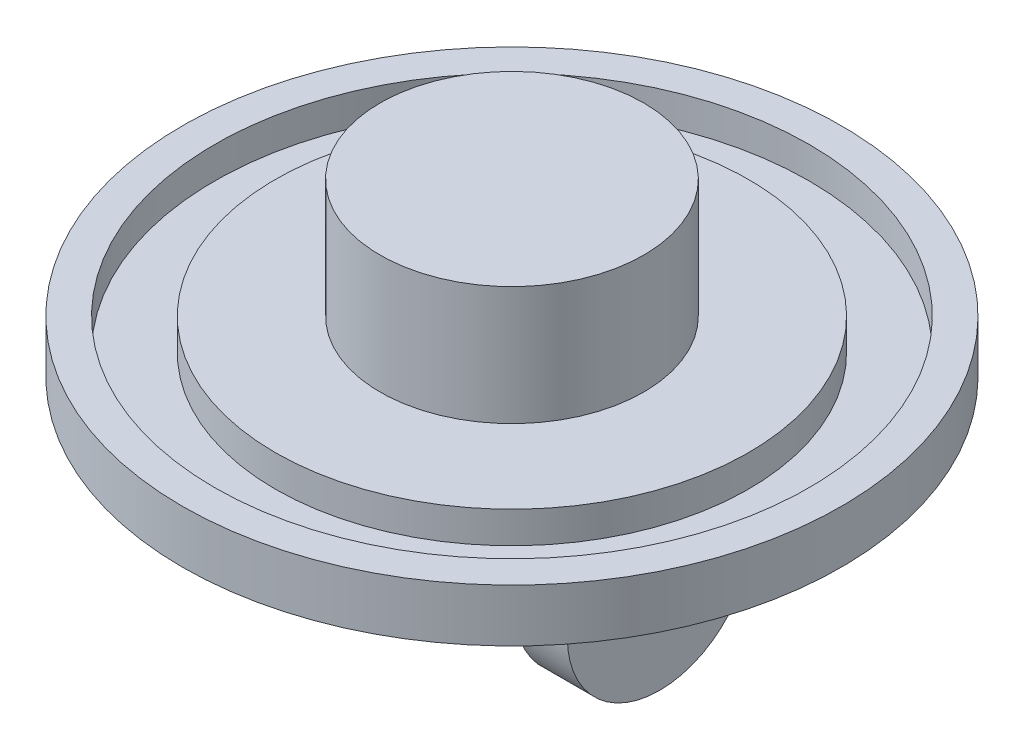
ISO-10303-21;
HEADER;
FILE_DESCRIPTION(('STEP AP214'),'2;1');
FILE_NAME('part.step','',(''),(''),'','','');
FILE_SCHEMA(('AUTOMOTIVE_DESIGN { 1 0 10303 214 1 1 1 1 }'));
ENDSEC;
DATA;
#1=APPLICATION_CONTEXT('core data for automotive mechanical design processes');
#2=APPLICATION_PROTOCOL_DEFINITION('international standard','automotive_design',2000,#1);
#3=PRODUCT_CONTEXT('',#1,'mechanical');
#4=PRODUCT('Part','Part','',(#3));
#5=PRODUCT_RELATED_PRODUCT_CATEGORY('part','',(#4));
#6=PRODUCT_DEFINITION_FORMATION('','',#4);
#7=PRODUCT_DEFINITION_CONTEXT('part definition',#1,'design');
#8=PRODUCT_DEFINITION('design','',#6,#7);
#9=PRODUCT_DEFINITION_SHAPE('','',#8);
#10=(LENGTH_UNIT() NAMED_UNIT(*) SI_UNIT(.MILLI.,.METRE.));
#11=(NAMED_UNIT(*) PLANE_ANGLE_UNIT() SI_UNIT($,.RADIAN.));
#12=(NAMED_UNIT(*) SI_UNIT($,.STERADIAN.) SOLID_ANGLE_UNIT());
#13=UNCERTAINTY_MEASURE_WITH_UNIT(LENGTH_MEASURE(1.E-05),#10,'distance_accuracy_value','');
#14=(GEOMETRIC_REPRESENTATION_CONTEXT(3) GLOBAL_UNCERTAINTY_ASSIGNED_CONTEXT((#13)) GLOBAL_UNIT_ASSIGNED_CONTEXT((#10,
#11,#12)) REPRESENTATION_CONTEXT('',''));
#15=CARTESIAN_POINT('',(0.,0.,0.));
#16=DIRECTION('',(0.,0.,1.));
#17=DIRECTION('',(1.,0.,0.));
#18=AXIS2_PLACEMENT_3D('',#15,#16,#17);
#19=CARTESIAN_POINT('',(-56.,-75.,0.));
#20=DIRECTION('',(1.,0.,0.));
#21=DIRECTION('',(0.,0.,-1.));
#22=AXIS2_PLACEMENT_3D('',#19,#20,#21);
#23=PLANE('',#22);
#24=CARTESIAN_POINT('',(-56.,-40.,0.));
#25=DIRECTION('',(-1.,0.,0.));
#26=DIRECTION('',(0.,0.,1.));
#27=AXIS2_PLACEMENT_3D('',#24,#25,#26);
#28=CIRCLE('',#27,35.);
#29=CARTESIAN_POINT('',(-56.,-40.,-35.));
#30=VERTEX_POINT('',#29);
#31=CARTESIAN_POINT('',(-56.,-40.,35.));
#32=VERTEX_POINT('',#31);
#33=EDGE_CURVE('E117',#30,#32,#28,.T.);
#34=ORIENTED_EDGE('',*,*,#33,.T.);
#35=DIRECTION('',(0.,1.,0.));
#36=VECTOR('',#35,1.);
#37=CARTESIAN_POINT('',(-56.,-75.,35.));
#38=LINE('',#37,#36);
#39=CARTESIAN_POINT('',(-56.,0.,35.));
#40=VERTEX_POINT('',#39);
#41=EDGE_CURVE('E74',#32,#40,#38,.T.);
#42=ORIENTED_EDGE('',*,*,#41,.T.);
#43=DIRECTION('',(0.,0.,-1.));
#44=VECTOR('',#43,1.);
#45=CARTESIAN_POINT('',(-56.,0.,0.));
#46=LINE('',#45,#44);
#47=CARTESIAN_POINT('',(-56.,0.,-35.));
#48=VERTEX_POINT('',#47);
#49=EDGE_CURVE('E163',#40,#48,#46,.T.);
#50=ORIENTED_EDGE('',*,*,#49,.T.);
#51=DIRECTION('',(0.,1.,0.));
#52=VECTOR('',#51,1.);
#53=CARTESIAN_POINT('',(-56.,-75.,-35.));
#54=LINE('',#53,#52);
#55=EDGE_CURVE('E119',#30,#48,#54,.T.);
#56=ORIENTED_EDGE('',*,*,#55,.F.);
#57=EDGE_LOOP('',(#34,#42,#50,#56));
#58=FACE_BOUND('',#57,.T.);
#59=ADVANCED_FACE('F49',(#58),#23,.F.);
#60=CARTESIAN_POINT('',(-36.,-75.,0.));
#61=DIRECTION('',(-1.,0.,0.));
#62=DIRECTION('',(0.,0.,1.));
#63=AXIS2_PLACEMENT_3D('',#60,#61,#62);
#64=PLANE('',#63);
#65=DIRECTION('',(0.,1.,0.));
#66=VECTOR('',#65,1.);
#67=CARTESIAN_POINT('',(-36.,-75.,35.));
#68=LINE('',#67,#66);
#69=CARTESIAN_POINT('',(-36.,-40.,35.));
#70=VERTEX_POINT('',#69);
#71=CARTESIAN_POINT('',(-36.,0.,35.));
#72=VERTEX_POINT('',#71);
#73=EDGE_CURVE('E168',#70,#72,#68,.T.);
#74=ORIENTED_EDGE('',*,*,#73,.F.);
#75=CARTESIAN_POINT('',(-36.,-40.,0.));
#76=DIRECTION('',(-1.,0.,0.));
#77=DIRECTION('',(0.,0.,1.));
#78=AXIS2_PLACEMENT_3D('',#75,#76,#77);
#79=CIRCLE('',#78,35.);
#80=CARTESIAN_POINT('',(-36.,-40.,-35.));
#81=VERTEX_POINT('',#80);
#82=EDGE_CURVE('E129',#81,#70,#79,.T.);
#83=ORIENTED_EDGE('',*,*,#82,.F.);
#84=DIRECTION('',(0.,1.,0.));
#85=VECTOR('',#84,1.);
#86=CARTESIAN_POINT('',(-36.,-75.,-35.));
#87=LINE('',#86,#85);
#88=CARTESIAN_POINT('',(-36.,0.,-35.));
#89=VERTEX_POINT('',#88);
#90=EDGE_CURVE('E143',#81,#89,#87,.T.);
#91=ORIENTED_EDGE('',*,*,#90,.T.);
#92=DIRECTION('',(0.,0.,1.));
#93=VECTOR('',#92,1.);
#94=CARTESIAN_POINT('',(-36.,0.,0.));
#95=LINE('',#94,#93);
#96=EDGE_CURVE('E161',#89,#72,#95,.T.);
#97=ORIENTED_EDGE('',*,*,#96,.T.);
#98=EDGE_LOOP('',(#74,#83,#91,#97));
#99=FACE_BOUND('',#98,.T.);
#100=ADVANCED_FACE('F167',(#99),#64,.F.);
#101=CARTESIAN_POINT('',(36.,-75.,0.));
#102=DIRECTION('',(-1.,0.,0.));
#103=DIRECTION('',(0.,0.,1.));
#104=AXIS2_PLACEMENT_3D('',#101,#102,#103);
#105=PLANE('',#104);
#106=CARTESIAN_POINT('',(36.,-40.,0.));
#107=DIRECTION('',(-1.,0.,0.));
#108=DIRECTION('',(0.,0.,1.));
#109=AXIS2_PLACEMENT_3D('',#106,#107,#108);
#110=CIRCLE('',#109,35.);
#111=CARTESIAN_POINT('',(36.,-40.,-35.));
#112=VERTEX_POINT('',#111);
#113=CARTESIAN_POINT('',(36.,-40.,35.));
#114=VERTEX_POINT('',#113);
#115=EDGE_CURVE('E122',#112,#114,#110,.T.);
#116=ORIENTED_EDGE('',*,*,#115,.T.);
#117=DIRECTION('',(0.,1.,0.));
#118=VECTOR('',#117,1.);
#119=CARTESIAN_POINT('',(36.,-75.,35.));
#120=LINE('',#119,#118);
#121=CARTESIAN_POINT('',(36.,0.,35.));
#122=VERTEX_POINT('',#121);
#123=EDGE_CURVE('E164',#114,#122,#120,.T.);
#124=ORIENTED_EDGE('',*,*,#123,.T.);
#125=DIRECTION('',(0.,0.,1.));
#126=VECTOR('',#125,1.);
#127=CARTESIAN_POINT('',(36.,0.,0.));
#128=LINE('',#127,#126);
#129=CARTESIAN_POINT('',(36.,0.,-35.));
#130=VERTEX_POINT('',#129);
#131=EDGE_CURVE('E187',#130,#122,#128,.T.);
#132=ORIENTED_EDGE('',*,*,#131,.F.);
#133=DIRECTION('',(0.,1.,0.));
#134=VECTOR('',#133,1.);
#135=CARTESIAN_POINT('',(36.,-75.,-35.));
#136=LINE('',#135,#134);
#137=EDGE_CURVE('E177',#112,#130,#136,.T.);
#138=ORIENTED_EDGE('',*,*,#137,.F.);
#139=EDGE_LOOP('',(#116,#124,#132,#138));
#140=FACE_BOUND('',#139,.T.);
#141=ADVANCED_FACE('F251',(#140),#105,.T.);
#142=CARTESIAN_POINT('',(56.,-75.,0.));
#143=DIRECTION('',(1.,0.,0.));
#144=DIRECTION('',(0.,0.,-1.));
#145=AXIS2_PLACEMENT_3D('',#142,#143,#144);
#146=PLANE('',#145);
#147=DIRECTION('',(0.,1.,0.));
#148=VECTOR('',#147,1.);
#149=CARTESIAN_POINT('',(56.0000000000001,-75.,35.));
#150=LINE('',#149,#148);
#151=CARTESIAN_POINT('',(56.0000000000001,-40.,35.));
#152=VERTEX_POINT('',#151);
#153=CARTESIAN_POINT('',(56.0000000000001,0.,35.));
#154=VERTEX_POINT('',#153);
#155=EDGE_CURVE('E180',#152,#154,#150,.T.);
#156=ORIENTED_EDGE('',*,*,#155,.F.);
#157=CARTESIAN_POINT('',(56.,-40.,0.));
#158=DIRECTION('',(1.,0.,0.));
#159=DIRECTION('',(0.,0.,-1.));
#160=AXIS2_PLACEMENT_3D('',#157,#158,#159);
#161=CIRCLE('',#160,35.);
#162=CARTESIAN_POINT('',(56.,-40.,-35.));
#163=VERTEX_POINT('',#162);
#164=EDGE_CURVE('E198',#163,#152,#161,.F.);
#165=ORIENTED_EDGE('',*,*,#164,.F.);
#166=DIRECTION('',(0.,1.,0.));
#167=VECTOR('',#166,1.);
#168=CARTESIAN_POINT('',(56.,-75.,-35.));
#169=LINE('',#168,#167);
#170=CARTESIAN_POINT('',(56.,0.,-35.));
#171=VERTEX_POINT('',#170);
#172=EDGE_CURVE('E66',#163,#171,#169,.T.);
#173=ORIENTED_EDGE('',*,*,#172,.T.);
#174=DIRECTION('',(0.,0.,-1.));
#175=VECTOR('',#174,1.);
#176=CARTESIAN_POINT('',(56.,0.,0.));
#177=LINE('',#176,#175);
#178=EDGE_CURVE('E182',#154,#171,#177,.T.);
#179=ORIENTED_EDGE('',*,*,#178,.F.);
#180=EDGE_LOOP('',(#156,#165,#173,#179));
#181=FACE_BOUND('',#180,.T.);
#182=ADVANCED_FACE('F257',(#181),#146,.T.);
#183=CARTESIAN_POINT('',(0.,-75.,35.));
#184=DIRECTION('',(0.,0.,-1.));
#185=DIRECTION('',(-1.,0.,0.));
#186=AXIS2_PLACEMENT_3D('',#183,#184,#185);
#187=PLANE('',#186);
#188=DIRECTION('',(-1.,0.,0.));
#189=VECTOR('',#188,1.);
#190=CARTESIAN_POINT('',(105.497474683058,-40.,35.));
#191=LINE('',#190,#189);
#192=EDGE_CURVE('E126',#70,#32,#191,.T.);
#193=ORIENTED_EDGE('',*,*,#192,.F.);
#194=ORIENTED_EDGE('',*,*,#73,.T.);
#195=DIRECTION('',(-1.,0.,0.));
#196=VECTOR('',#195,1.);
#197=CARTESIAN_POINT('',(0.,0.,35.));
#198=LINE('',#197,#196);
#199=EDGE_CURVE('E138',#72,#40,#198,.T.);
#200=ORIENTED_EDGE('',*,*,#199,.T.);
#201=ORIENTED_EDGE('',*,*,#41,.F.);
#202=EDGE_LOOP('',(#193,#194,#200,#201));
#203=FACE_BOUND('',#202,.T.);
#204=ADVANCED_FACE('F136',(#203),#187,.F.);
#205=CARTESIAN_POINT('',(0.,-75.,-35.));
#206=DIRECTION('',(0.,0.,-1.));
#207=DIRECTION('',(-1.,0.,0.));
#208=AXIS2_PLACEMENT_3D('',#205,#206,#207);
#209=PLANE('',#208);
#210=ORIENTED_EDGE('',*,*,#90,.F.);
#211=DIRECTION('',(-1.,0.,0.));
#212=VECTOR('',#211,1.);
#213=CARTESIAN_POINT('',(105.497474683058,-40.,-35.));
#214=LINE('',#213,#212);
#215=EDGE_CURVE('E197',#81,#30,#214,.T.);
#216=ORIENTED_EDGE('',*,*,#215,.T.);
#217=ORIENTED_EDGE('',*,*,#55,.T.);
#218=DIRECTION('',(-1.,0.,0.));
#219=VECTOR('',#218,1.);
#220=CARTESIAN_POINT('',(0.,0.,-35.));
#221=LINE('',#220,#219);
#222=EDGE_CURVE('E170',#89,#48,#221,.T.);
#223=ORIENTED_EDGE('',*,*,#222,.F.);
#224=EDGE_LOOP('',(#210,#216,#217,#223));
#225=FACE_BOUND('',#224,.T.);
#226=ADVANCED_FACE('F156',(#225),#209,.T.);
#227=CARTESIAN_POINT('',(0.,0.,0.));
#228=DIRECTION('',(0.,1.,0.));
#229=DIRECTION('',(0.,0.,1.));
#230=AXIS2_PLACEMENT_3D('',#227,#228,#229);
#231=PLANE('',#230);
#232=CARTESIAN_POINT('',(0.,0.,0.));
#233=DIRECTION('',(0.,-1.,0.));
#234=DIRECTION('',(0.,0.,-1.));
#235=AXIS2_PLACEMENT_3D('',#232,#233,#234);
#236=CIRCLE('',#235,15.);
#237=CARTESIAN_POINT('',(0.,0.,-15.));
#238=VERTEX_POINT('',#237);
#239=EDGE_CURVE('E213',#238,#238,#236,.T.);
#240=ORIENTED_EDGE('',*,*,#239,.F.);
#241=EDGE_LOOP('',(#240));
#242=FACE_BOUND('',#241,.T.);
#243=ORIENTED_EDGE('',*,*,#131,.T.);
#244=DIRECTION('',(1.,0.,0.));
#245=VECTOR('',#244,1.);
#246=CARTESIAN_POINT('',(0.,0.,35.));
#247=LINE('',#246,#245);
#248=EDGE_CURVE('E190',#122,#154,#247,.T.);
#249=ORIENTED_EDGE('',*,*,#248,.T.);
#250=ORIENTED_EDGE('',*,*,#178,.T.);
#251=DIRECTION('',(1.,0.,0.));
#252=VECTOR('',#251,1.);
#253=CARTESIAN_POINT('',(0.,0.,-35.));
#254=LINE('',#253,#252);
#255=EDGE_CURVE('E185',#130,#171,#254,.T.);
#256=ORIENTED_EDGE('',*,*,#255,.F.);
#257=EDGE_LOOP('',(#243,#249,#250,#256));
#258=FACE_BOUND('',#257,.T.);
#259=CARTESIAN_POINT('',(0.,0.,0.));
#260=DIRECTION('',(0.,1.,0.));
#261=DIRECTION('',(0.,0.,1.));
#262=AXIS2_PLACEMENT_3D('',#259,#260,#261);
#263=CIRCLE('',#262,125.);
#264=CARTESIAN_POINT('',(0.,0.,125.));
#265=VERTEX_POINT('',#264);
#266=EDGE_CURVE('E53',#265,#265,#263,.T.);
#267=ORIENTED_EDGE('',*,*,#266,.F.);
#268=EDGE_LOOP('',(#267));
#269=FACE_BOUND('',#268,.T.);
#270=ORIENTED_EDGE('',*,*,#199,.F.);
#271=ORIENTED_EDGE('',*,*,#96,.F.);
#272=ORIENTED_EDGE('',*,*,#222,.T.);
#273=ORIENTED_EDGE('',*,*,#49,.F.);
#274=EDGE_LOOP('',(#270,#271,#272,#273));
#275=FACE_BOUND('',#274,.T.);
#276=ADVANCED_FACE('F153',(#242,#258,#269,#275),#231,.F.);
#277=CARTESIAN_POINT('',(0.,20.,0.));
#278=DIRECTION('',(0.,-1.,0.));
#279=DIRECTION('',(0.,0.,-1.));
#280=AXIS2_PLACEMENT_3D('',#277,#278,#279);
#281=CYLINDRICAL_SURFACE('',#280,125.);
#282=CARTESIAN_POINT('',(0.,20.,0.));
#283=DIRECTION('',(0.,1.,0.));
#284=DIRECTION('',(0.,0.,1.));
#285=AXIS2_PLACEMENT_3D('',#282,#283,#284);
#286=CIRCLE('',#285,125.);
#287=CARTESIAN_POINT('',(0.,20.,125.));
#288=VERTEX_POINT('',#287);
#289=EDGE_CURVE('E58',#288,#288,#286,.T.);
#290=ORIENTED_EDGE('',*,*,#289,.F.);
#291=EDGE_LOOP('',(#290));
#292=FACE_BOUND('',#291,.T.);
#293=ORIENTED_EDGE('',*,*,#266,.T.);
#294=EDGE_LOOP('',(#293));
#295=FACE_BOUND('',#294,.T.);
#296=ADVANCED_FACE('F51',(#292,#295),#281,.T.);
#297=CARTESIAN_POINT('',(0.,20.,0.));
#298=DIRECTION('',(0.,1.,0.));
#299=DIRECTION('',(0.,0.,1.));
#300=AXIS2_PLACEMENT_3D('',#297,#298,#299);
#301=PLANE('',#300);
#302=CARTESIAN_POINT('',(0.,20.,0.));
#303=DIRECTION('',(0.,1.,0.));
#304=DIRECTION('',(0.,0.,1.));
#305=AXIS2_PLACEMENT_3D('',#302,#303,#304);
#306=CIRCLE('',#305,112.75);
#307=CARTESIAN_POINT('',(0.,20.,112.75));
#308=VERTEX_POINT('',#307);
#309=EDGE_CURVE('E201',#308,#308,#306,.T.);
#310=ORIENTED_EDGE('',*,*,#309,.F.);
#311=EDGE_LOOP('',(#310));
#312=FACE_BOUND('',#311,.T.);
#313=ORIENTED_EDGE('',*,*,#289,.T.);
#314=EDGE_LOOP('',(#313));
#315=FACE_BOUND('',#314,.T.);
#316=ADVANCED_FACE('F285',(#312,#315),#301,.T.);
#317=CARTESIAN_POINT('',(0.,-75.,35.));
#318=DIRECTION('',(0.,0.,1.));
#319=DIRECTION('',(1.,0.,0.));
#320=AXIS2_PLACEMENT_3D('',#317,#318,#319);
#321=PLANE('',#320);
#322=EDGE_CURVE('E132',#152,#114,#191,.T.);
#323=ORIENTED_EDGE('',*,*,#322,.F.);
#324=ORIENTED_EDGE('',*,*,#155,.T.);
#325=ORIENTED_EDGE('',*,*,#248,.F.);
#326=ORIENTED_EDGE('',*,*,#123,.F.);
#327=EDGE_LOOP('',(#323,#324,#325,#326));
#328=FACE_BOUND('',#327,.T.);
#329=ADVANCED_FACE('F255',(#328),#321,.T.);
#330=CARTESIAN_POINT('',(0.,-75.,-35.));
#331=DIRECTION('',(0.,0.,1.));
#332=DIRECTION('',(1.,0.,0.));
#333=AXIS2_PLACEMENT_3D('',#330,#331,#332);
#334=PLANE('',#333);
#335=ORIENTED_EDGE('',*,*,#172,.F.);
#336=EDGE_CURVE('E123',#163,#112,#214,.T.);
#337=ORIENTED_EDGE('',*,*,#336,.T.);
#338=ORIENTED_EDGE('',*,*,#137,.T.);
#339=ORIENTED_EDGE('',*,*,#255,.T.);
#340=EDGE_LOOP('',(#335,#337,#338,#339));
#341=FACE_BOUND('',#340,.T.);
#342=ADVANCED_FACE('F293',(#341),#334,.F.);
#343=CARTESIAN_POINT('',(105.497474683058,-40.,0.));
#344=DIRECTION('',(-1.,0.,0.));
#345=DIRECTION('',(0.,0.,1.));
#346=AXIS2_PLACEMENT_3D('',#343,#344,#345);
#347=CYLINDRICAL_SURFACE('',#346,35.);
#348=ORIENTED_EDGE('',*,*,#336,.F.);
#349=ORIENTED_EDGE('',*,*,#164,.T.);
#350=ORIENTED_EDGE('',*,*,#322,.T.);
#351=ORIENTED_EDGE('',*,*,#115,.F.);
#352=EDGE_LOOP('',(#348,#349,#350,#351));
#353=FACE_BOUND('',#352,.T.);
#354=ADVANCED_FACE('F318',(#353),#347,.T.);
#355=ORIENTED_EDGE('',*,*,#82,.T.);
#356=ORIENTED_EDGE('',*,*,#192,.T.);
#357=ORIENTED_EDGE('',*,*,#33,.F.);
#358=ORIENTED_EDGE('',*,*,#215,.F.);
#359=EDGE_LOOP('',(#355,#356,#357,#358));
#360=FACE_BOUND('',#359,.T.);
#361=ADVANCED_FACE('F127',(#360),#347,.T.);
#362=CARTESIAN_POINT('',(0.,8.,0.));
#363=DIRECTION('',(0.,1.,0.));
#364=DIRECTION('',(0.,0.,1.));
#365=AXIS2_PLACEMENT_3D('',#362,#363,#364);
#366=CYLINDRICAL_SURFACE('',#365,112.75);
#367=CARTESIAN_POINT('',(0.,8.,0.));
#368=DIRECTION('',(0.,1.,0.));
#369=DIRECTION('',(0.,0.,1.));
#370=AXIS2_PLACEMENT_3D('',#367,#368,#369);
#371=CIRCLE('',#370,112.75);
#372=CARTESIAN_POINT('',(0.,8.,112.75));
#373=VERTEX_POINT('',#372);
#374=EDGE_CURVE('E133',#373,#373,#371,.T.);
#375=ORIENTED_EDGE('',*,*,#374,.F.);
#376=EDGE_LOOP('',(#375));
#377=FACE_BOUND('',#376,.T.);
#378=ORIENTED_EDGE('',*,*,#309,.T.);
#379=EDGE_LOOP('',(#378));
#380=FACE_BOUND('',#379,.T.);
#381=ADVANCED_FACE('F313',(#377,#380),#366,.F.);
#382=CARTESIAN_POINT('',(0.,8.,0.));
#383=DIRECTION('',(0.,1.,0.));
#384=DIRECTION('',(0.,0.,1.));
#385=AXIS2_PLACEMENT_3D('',#382,#383,#384);
#386=PLANE('',#385);
#387=CARTESIAN_POINT('',(0.,8.,0.));
#388=DIRECTION('',(0.,1.,0.));
#389=DIRECTION('',(0.,0.,1.));
#390=AXIS2_PLACEMENT_3D('',#387,#388,#389);
#391=CIRCLE('',#390,89.75);
#392=CARTESIAN_POINT('',(0.,8.,89.75));
#393=VERTEX_POINT('',#392);
#394=EDGE_CURVE('E204',#393,#393,#391,.T.);
#395=ORIENTED_EDGE('',*,*,#394,.F.);
#396=EDGE_LOOP('',(#395));
#397=FACE_BOUND('',#396,.T.);
#398=ORIENTED_EDGE('',*,*,#374,.T.);
#399=EDGE_LOOP('',(#398));
#400=FACE_BOUND('',#399,.T.);
#401=ADVANCED_FACE('F307',(#397,#400),#386,.T.);
#402=CARTESIAN_POINT('',(0.,8.,0.));
#403=DIRECTION('',(0.,1.,0.));
#404=DIRECTION('',(0.,0.,1.));
#405=AXIS2_PLACEMENT_3D('',#402,#403,#404);
#406=CYLINDRICAL_SURFACE('',#405,89.75);
#407=ORIENTED_EDGE('',*,*,#394,.T.);
#408=EDGE_LOOP('',(#407));
#409=FACE_BOUND('',#408,.T.);
#410=CARTESIAN_POINT('',(0.,20.,0.));
#411=DIRECTION('',(0.,1.,0.));
#412=DIRECTION('',(0.,0.,1.));
#413=AXIS2_PLACEMENT_3D('',#410,#411,#412);
#414=CIRCLE('',#413,89.75);
#415=CARTESIAN_POINT('',(0.,20.,89.75));
#416=VERTEX_POINT('',#415);
#417=EDGE_CURVE('E207',#416,#416,#414,.T.);
#418=ORIENTED_EDGE('',*,*,#417,.F.);
#419=EDGE_LOOP('',(#418));
#420=FACE_BOUND('',#419,.T.);
#421=ADVANCED_FACE('F280',(#409,#420),#406,.T.);
#422=CARTESIAN_POINT('',(0.,65.,0.));
#423=DIRECTION('',(0.,1.,0.));
#424=DIRECTION('',(0.,0.,1.));
#425=AXIS2_PLACEMENT_3D('',#422,#423,#424);
#426=PLANE('',#425);
#427=CARTESIAN_POINT('',(0.,65.,0.));
#428=DIRECTION('',(0.,1.,0.));
#429=DIRECTION('',(0.,0.,1.));
#430=AXIS2_PLACEMENT_3D('',#427,#428,#429);
#431=CIRCLE('',#430,50.);
#432=CARTESIAN_POINT('',(0.,65.,-50.));
#433=VERTEX_POINT('',#432);
#434=EDGE_CURVE('E139',#433,#433,#431,.T.);
#435=ORIENTED_EDGE('',*,*,#434,.T.);
#436=EDGE_LOOP('',(#435));
#437=FACE_BOUND('',#436,.T.);
#438=ADVANCED_FACE('F277',(#437),#426,.T.);
#439=CARTESIAN_POINT('',(0.,65.,0.));
#440=DIRECTION('',(0.,-1.,0.));
#441=DIRECTION('',(0.,0.,-1.));
#442=AXIS2_PLACEMENT_3D('',#439,#440,#441);
#443=CYLINDRICAL_SURFACE('',#442,50.);
#444=CARTESIAN_POINT('',(0.,20.,0.));
#445=DIRECTION('',(0.,1.,0.));
#446=DIRECTION('',(0.,0.,1.));
#447=AXIS2_PLACEMENT_3D('',#444,#445,#446);
#448=CIRCLE('',#447,50.);
#449=CARTESIAN_POINT('',(0.,20.,-50.));
#450=VERTEX_POINT('',#449);
#451=EDGE_CURVE('E12',#450,#450,#448,.T.);
#452=CARTESIAN_POINT('',(0.,65.,-50.));
#453=CARTESIAN_POINT('',(0.,64.53125,-50.));
#454=CARTESIAN_POINT('',(0.,64.0625,-50.));
#455=CARTESIAN_POINT('',(0.,63.125,-50.));
#456=CARTESIAN_POINT('',(0.,62.65625,-50.));
#457=CARTESIAN_POINT('',(0.,61.71875,-50.));
#458=CARTESIAN_POINT('',(0.,61.25,-50.));
#459=CARTESIAN_POINT('',(0.,60.3125,-50.));
#460=CARTESIAN_POINT('',(0.,59.84375,-50.));
#461=CARTESIAN_POINT('',(0.,58.90625,-50.));
#462=CARTESIAN_POINT('',(0.,58.4375,-50.));
#463=CARTESIAN_POINT('',(0.,57.5,-50.));
#464=CARTESIAN_POINT('',(0.,57.03125,-50.));
#465=CARTESIAN_POINT('',(0.,56.09375,-50.));
#466=CARTESIAN_POINT('',(0.,55.625,-50.));
#467=CARTESIAN_POINT('',(0.,54.6875,-50.));
#468=CARTESIAN_POINT('',(0.,54.21875,-50.));
#469=CARTESIAN_POINT('',(0.,53.28125,-50.));
#470=CARTESIAN_POINT('',(0.,52.8125,-50.));
#471=CARTESIAN_POINT('',(0.,51.875,-50.));
#472=CARTESIAN_POINT('',(0.,51.40625,-50.));
#473=CARTESIAN_POINT('',(0.,50.46875,-50.));
#474=CARTESIAN_POINT('',(0.,50.,-50.));
#475=CARTESIAN_POINT('',(0.,49.0625,-50.));
#476=CARTESIAN_POINT('',(0.,48.59375,-50.));
#477=CARTESIAN_POINT('',(0.,47.65625,-50.));
#478=CARTESIAN_POINT('',(0.,47.1875,-50.));
#479=CARTESIAN_POINT('',(0.,46.25,-50.));
#480=CARTESIAN_POINT('',(0.,45.78125,-50.));
#481=CARTESIAN_POINT('',(0.,44.84375,-50.));
#482=CARTESIAN_POINT('',(0.,44.375,-50.));
#483=CARTESIAN_POINT('',(0.,43.4375,-50.));
#484=CARTESIAN_POINT('',(0.,42.96875,-50.));
#485=CARTESIAN_POINT('',(0.,42.03125,-50.));
#486=CARTESIAN_POINT('',(0.,41.5625,-50.));
#487=CARTESIAN_POINT('',(0.,40.625,-50.));
#488=CARTESIAN_POINT('',(0.,40.15625,-50.));
#489=CARTESIAN_POINT('',(0.,39.21875,-50.));
#490=CARTESIAN_POINT('',(0.,38.75,-50.));
#491=CARTESIAN_POINT('',(0.,37.8125,-50.));
#492=CARTESIAN_POINT('',(0.,37.34375,-50.));
#493=CARTESIAN_POINT('',(0.,36.40625,-50.));
#494=CARTESIAN_POINT('',(0.,35.9375,-50.));
#495=CARTESIAN_POINT('',(0.,35.,-50.));
#496=CARTESIAN_POINT('',(0.,34.53125,-50.));
#497=CARTESIAN_POINT('',(0.,33.59375,-50.));
#498=CARTESIAN_POINT('',(0.,33.125,-50.));
#499=CARTESIAN_POINT('',(0.,32.1875,-50.));
#500=CARTESIAN_POINT('',(0.,31.71875,-50.));
#501=CARTESIAN_POINT('',(0.,30.78125,-50.));
#502=CARTESIAN_POINT('',(0.,30.3125,-50.));
#503=CARTESIAN_POINT('',(0.,29.375,-50.));
#504=CARTESIAN_POINT('',(0.,28.90625,-50.));
#505=CARTESIAN_POINT('',(0.,27.96875,-50.));
#506=CARTESIAN_POINT('',(0.,27.5,-50.));
#507=CARTESIAN_POINT('',(0.,26.5625,-50.));
#508=CARTESIAN_POINT('',(0.,26.09375,-50.));
#509=CARTESIAN_POINT('',(0.,25.15625,-50.));
#510=CARTESIAN_POINT('',(0.,24.6875,-50.));
#511=CARTESIAN_POINT('',(0.,23.75,-50.));
#512=CARTESIAN_POINT('',(0.,23.28125,-50.));
#513=CARTESIAN_POINT('',(0.,22.34375,-50.));
#514=CARTESIAN_POINT('',(0.,21.875,-50.));
#515=CARTESIAN_POINT('',(0.,20.9375,-50.));
#516=CARTESIAN_POINT('',(0.,20.46875,-50.));
#517=CARTESIAN_POINT('',(0.,20.,-50.));
#518=B_SPLINE_CURVE_WITH_KNOTS('',3,(#452,#453,#454,#455,#456,#457,#458,#459,#460,#461,#462,
#463,#464,#465,#466,#467,#468,#469,#470,#471,#472,#473,#474,#475,#476,#477,#478,#479,#480,#481,
#482,#483,#484,#485,#486,#487,#488,#489,#490,#491,#492,#493,#494,#495,#496,#497,#498,#499,#500,
#501,#502,#503,#504,#505,#506,#507,#508,#509,#510,#511,#512,#513,#514,#515,#516,#517),
.UNSPECIFIED.,.F.,.F.,(4,2,2,2,2,2,2,2,2,2,2,2,2,2,2,2,2,2,2,2,2,2,2,2,2,2,2,2,2,2,2,2,4),(0.,
1.40625,2.8125,4.21874999999999,5.62499999999999,7.03125,8.43749999999999,9.84374999999999,
11.25,12.65625,14.0625,15.46875,16.875,18.28125,19.6875,21.09375,22.5,23.90625,25.3125,26.71875,
28.125,29.53125,30.9375,32.34375,33.75,35.15625,36.5625,37.96875,39.375,40.78125,42.1875,
43.59375,45.),.UNSPECIFIED.);
#519=EDGE_CURVE('BSEAM279',#433,#450,#518,.T.);
#520=ORIENTED_EDGE('',*,*,#434,.F.);
#521=ORIENTED_EDGE('',*,*,#451,.T.);
#522=ORIENTED_EDGE('',*,*,#519,.T.);
#523=ORIENTED_EDGE('',*,*,#519,.F.);
#524=EDGE_LOOP('',(#520,#522,#521,#523));
#525=FACE_BOUND('',#524,.T.);
#526=ADVANCED_FACE('F279',(#525),#443,.T.);
#527=ORIENTED_EDGE('',*,*,#451,.F.);
#528=EDGE_LOOP('',(#527));
#529=FACE_BOUND('',#528,.T.);
#530=ORIENTED_EDGE('',*,*,#417,.T.);
#531=EDGE_LOOP('',(#530));
#532=FACE_BOUND('',#531,.T.);
#533=ADVANCED_FACE('F242',(#529,#532),#301,.T.);
#534=CARTESIAN_POINT('',(0.,6.,0.));
#535=DIRECTION('',(0.,-1.,0.));
#536=DIRECTION('',(0.,0.,-1.));
#537=AXIS2_PLACEMENT_3D('',#534,#535,#536);
#538=CYLINDRICAL_SURFACE('',#537,15.);
#539=CARTESIAN_POINT('',(0.,6.,0.));
#540=DIRECTION('',(0.,-1.,0.));
#541=DIRECTION('',(0.,0.,-1.));
#542=AXIS2_PLACEMENT_3D('',#539,#540,#541);
#543=CIRCLE('',#542,15.);
#544=CARTESIAN_POINT('',(0.,6.,-15.));
#545=VERTEX_POINT('',#544);
#546=EDGE_CURVE('E210',#545,#545,#543,.T.);
#547=ORIENTED_EDGE('',*,*,#546,.F.);
#548=EDGE_LOOP('',(#547));
#549=FACE_BOUND('',#548,.T.);
#550=ORIENTED_EDGE('',*,*,#239,.T.);
#551=EDGE_LOOP('',(#550));
#552=FACE_BOUND('',#551,.T.);
#553=ADVANCED_FACE('F236',(#549,#552),#538,.F.);
#554=CARTESIAN_POINT('',(0.,6.,0.));
#555=DIRECTION('',(0.,-1.,0.));
#556=DIRECTION('',(0.,0.,-1.));
#557=AXIS2_PLACEMENT_3D('',#554,#555,#556);
#558=PLANE('',#557);
#559=CARTESIAN_POINT('',(0.,6.,0.));
#560=DIRECTION('',(0.,-1.,0.));
#561=DIRECTION('',(0.,0.,-1.));
#562=AXIS2_PLACEMENT_3D('',#559,#560,#561);
#563=CIRCLE('',#562,6.);
#564=CARTESIAN_POINT('',(0.,6.,-6.));
#565=VERTEX_POINT('',#564);
#566=EDGE_CURVE('E219',#565,#565,#563,.T.);
#567=ORIENTED_EDGE('',*,*,#566,.F.);
#568=EDGE_LOOP('',(#567));
#569=FACE_BOUND('',#568,.T.);
#570=ORIENTED_EDGE('',*,*,#546,.T.);
#571=EDGE_LOOP('',(#570));
#572=FACE_BOUND('',#571,.T.);
#573=ADVANCED_FACE('F230',(#569,#572),#558,.T.);
#574=CARTESIAN_POINT('',(0.,56.,0.));
#575=DIRECTION('',(0.,-1.,0.));
#576=DIRECTION('',(0.,0.,-1.));
#577=AXIS2_PLACEMENT_3D('',#574,#575,#576);
#578=CYLINDRICAL_SURFACE('',#577,6.);
#579=CARTESIAN_POINT('',(0.,56.,0.));
#580=DIRECTION('',(0.,-1.,0.));
#581=DIRECTION('',(0.,0.,-1.));
#582=AXIS2_PLACEMENT_3D('',#579,#580,#581);
#583=CIRCLE('',#582,6.);
#584=CARTESIAN_POINT('',(0.,56.,-6.));
#585=VERTEX_POINT('',#584);
#586=EDGE_CURVE('E216',#585,#585,#583,.T.);
#587=ORIENTED_EDGE('',*,*,#586,.F.);
#588=EDGE_LOOP('',(#587));
#589=FACE_BOUND('',#588,.T.);
#590=ORIENTED_EDGE('',*,*,#566,.T.);
#591=EDGE_LOOP('',(#590));
#592=FACE_BOUND('',#591,.T.);
#593=ADVANCED_FACE('F227',(#589,#592),#578,.F.);
#594=CARTESIAN_POINT('',(0.,56.,0.));
#595=DIRECTION('',(0.,-1.,0.));
#596=DIRECTION('',(0.,0.,-1.));
#597=AXIS2_PLACEMENT_3D('',#594,#595,#596);
#598=PLANE('',#597);
#599=ORIENTED_EDGE('',*,*,#586,.T.);
#600=EDGE_LOOP('',(#599));
#601=FACE_BOUND('',#600,.T.);
#602=ADVANCED_FACE('F225',(#601),#598,.T.);
#603=CLOSED_SHELL('',(#59,#100,#141,#182,#204,#226,#276,#296,#316,#329,#342,#354,#361,#381,#401,
#421,#438,#526,#533,#553,#573,#593,#602));
#604=MANIFOLD_SOLID_BREP('B2',#603);
#605=ADVANCED_BREP_SHAPE_REPRESENTATION('',(#18,#604),#14);
#606=SHAPE_DEFINITION_REPRESENTATION(#9,#605);
ENDSEC;
END-ISO-10303-21;
